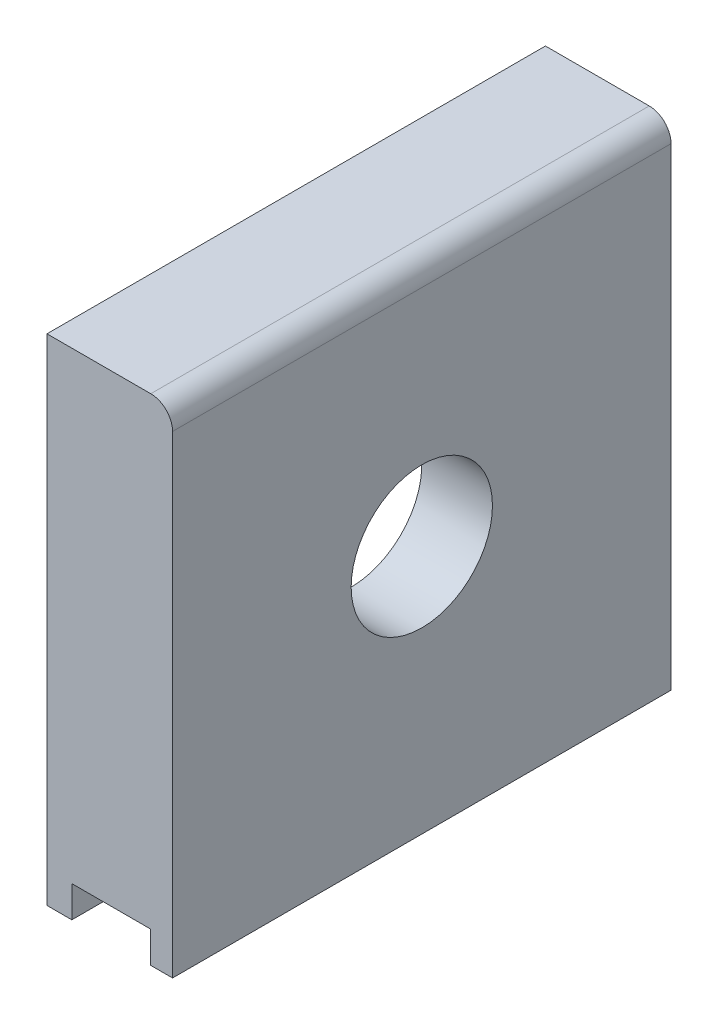
ISO-10303-21;
HEADER;
FILE_DESCRIPTION(('STEP AP214'),'2;1');
FILE_NAME('part.step','',(''),(''),'','','');
FILE_SCHEMA(('AUTOMOTIVE_DESIGN { 1 0 10303 214 1 1 1 1 }'));
ENDSEC;
DATA;
#1=APPLICATION_CONTEXT('core data for automotive mechanical design processes');
#2=APPLICATION_PROTOCOL_DEFINITION('international standard','automotive_design',2000,#1);
#3=PRODUCT_CONTEXT('',#1,'mechanical');
#4=PRODUCT('Part','Part','',(#3));
#5=PRODUCT_RELATED_PRODUCT_CATEGORY('part','',(#4));
#6=PRODUCT_DEFINITION_FORMATION('','',#4);
#7=PRODUCT_DEFINITION_CONTEXT('part definition',#1,'design');
#8=PRODUCT_DEFINITION('design','',#6,#7);
#9=PRODUCT_DEFINITION_SHAPE('','',#8);
#10=(LENGTH_UNIT() NAMED_UNIT(*) SI_UNIT(.MILLI.,.METRE.));
#11=(NAMED_UNIT(*) PLANE_ANGLE_UNIT() SI_UNIT($,.RADIAN.));
#12=(NAMED_UNIT(*) SI_UNIT($,.STERADIAN.) SOLID_ANGLE_UNIT());
#13=UNCERTAINTY_MEASURE_WITH_UNIT(LENGTH_MEASURE(1.E-05),#10,'distance_accuracy_value','');
#14=(GEOMETRIC_REPRESENTATION_CONTEXT(3) GLOBAL_UNCERTAINTY_ASSIGNED_CONTEXT((#13)) GLOBAL_UNIT_ASSIGNED_CONTEXT((#10,
#11,#12)) REPRESENTATION_CONTEXT('',''));
#15=CARTESIAN_POINT('',(0.,0.,0.));
#16=DIRECTION('',(0.,0.,1.));
#17=DIRECTION('',(1.,0.,0.));
#18=AXIS2_PLACEMENT_3D('',#15,#16,#17);
#19=CARTESIAN_POINT('',(0.,-58.3536796987528,-64.2855790451278));
#20=DIRECTION('',(0.,1.,0.));
#21=DIRECTION('',(-1.,0.,0.));
#22=AXIS2_PLACEMENT_3D('',#19,#20,#21);
#23=PLANE('',#22);
#24=DIRECTION('',(1.,0.,0.));
#25=VECTOR('',#24,1.);
#26=CARTESIAN_POINT('',(0.,-58.3536796987528,-31.75));
#27=LINE('',#26,#25);
#28=CARTESIAN_POINT('',(-30.425,-58.3536796987527,-31.75));
#29=VERTEX_POINT('',#28);
#30=CARTESIAN_POINT('',(-28.8411525679729,-58.3536796987527,-31.75));
#31=VERTEX_POINT('',#30);
#32=EDGE_CURVE('E167',#29,#31,#27,.T.);
#33=ORIENTED_EDGE('',*,*,#32,.T.);
#34=DIRECTION('',(0.,0.,-1.));
#35=VECTOR('',#34,1.);
#36=CARTESIAN_POINT('',(-28.8411525679729,-58.3536796987527,-31.75));
#37=LINE('',#36,#35);
#38=CARTESIAN_POINT('',(-28.8411525679729,-58.3536796987527,0.));
#39=VERTEX_POINT('',#38);
#40=EDGE_CURVE('E267',#39,#31,#37,.T.);
#41=ORIENTED_EDGE('',*,*,#40,.F.);
#42=DIRECTION('',(-1.,0.,0.));
#43=VECTOR('',#42,1.);
#44=CARTESIAN_POINT('',(0.,-58.3536796987528,0.));
#45=LINE('',#44,#43);
#46=CARTESIAN_POINT('',(-30.425,-58.3536796987527,0.));
#47=VERTEX_POINT('',#46);
#48=EDGE_CURVE('E190',#39,#47,#45,.T.);
#49=ORIENTED_EDGE('',*,*,#48,.T.);
#50=DIRECTION('',(0.,0.,1.));
#51=VECTOR('',#50,1.);
#52=CARTESIAN_POINT('',(-30.425,-58.3536796987527,-64.2855790451278));
#53=LINE('',#52,#51);
#54=EDGE_CURVE('E198',#29,#47,#53,.T.);
#55=ORIENTED_EDGE('',*,*,#54,.F.);
#56=EDGE_LOOP('',(#33,#41,#49,#55));
#57=FACE_BOUND('',#56,.T.);
#58=ADVANCED_FACE('F45',(#57),#23,.F.);
#59=CARTESIAN_POINT('',(-22.425,0.,-64.2855790451278));
#60=DIRECTION('',(1.,0.,0.));
#61=DIRECTION('',(0.,0.,-1.));
#62=AXIS2_PLACEMENT_3D('',#59,#60,#61);
#63=PLANE('',#62);
#64=CARTESIAN_POINT('',(-22.425,-42.4786796987528,-15.875));
#65=DIRECTION('',(1.,0.,0.));
#66=DIRECTION('',(0.,0.,-1.));
#67=AXIS2_PLACEMENT_3D('',#64,#65,#66);
#68=CIRCLE('',#67,4.50000000000001);
#69=CARTESIAN_POINT('',(-22.425,-42.4786796987528,-20.375));
#70=VERTEX_POINT('',#69);
#71=EDGE_CURVE('E148',#70,#70,#68,.F.);
#72=ORIENTED_EDGE('',*,*,#71,.T.);
#73=EDGE_LOOP('',(#72));
#74=FACE_BOUND('',#73,.T.);
#75=DIRECTION('',(0.,-1.,0.));
#76=VECTOR('',#75,1.);
#77=CARTESIAN_POINT('',(-22.425,0.,-31.75));
#78=LINE('',#77,#76);
#79=CARTESIAN_POINT('',(-22.425,-28.2044724546259,-31.75));
#80=VERTEX_POINT('',#79);
#81=CARTESIAN_POINT('',(-22.425,-58.3536796987527,-31.75));
#82=VERTEX_POINT('',#81);
#83=EDGE_CURVE('E171',#80,#82,#78,.T.);
#84=ORIENTED_EDGE('',*,*,#83,.F.);
#85=DIRECTION('',(0.,0.,1.));
#86=VECTOR('',#85,1.);
#87=CARTESIAN_POINT('',(-22.425,-28.2044724546259,-64.2855790451278));
#88=LINE('',#87,#86);
#89=CARTESIAN_POINT('',(-22.425,-28.2044724546259,0.));
#90=VERTEX_POINT('',#89);
#91=EDGE_CURVE('E195',#80,#90,#88,.T.);
#92=ORIENTED_EDGE('',*,*,#91,.T.);
#93=DIRECTION('',(0.,1.,0.));
#94=VECTOR('',#93,1.);
#95=CARTESIAN_POINT('',(-22.425,0.,0.));
#96=LINE('',#95,#94);
#97=CARTESIAN_POINT('',(-22.425,-58.3536796987527,0.));
#98=VERTEX_POINT('',#97);
#99=EDGE_CURVE('E160',#98,#90,#96,.T.);
#100=ORIENTED_EDGE('',*,*,#99,.F.);
#101=DIRECTION('',(0.,0.,1.));
#102=VECTOR('',#101,1.);
#103=CARTESIAN_POINT('',(-22.425,-58.3536796987527,-64.2855790451278));
#104=LINE('',#103,#102);
#105=EDGE_CURVE('E164',#82,#98,#104,.T.);
#106=ORIENTED_EDGE('',*,*,#105,.F.);
#107=EDGE_LOOP('',(#84,#92,#100,#106));
#108=FACE_BOUND('',#107,.T.);
#109=ADVANCED_FACE('F226',(#74,#108),#63,.T.);
#110=CARTESIAN_POINT('',(-23.8411525679729,-58.3536796987527,0.));
#111=VERTEX_POINT('',#110);
#112=EDGE_CURVE('E191',#98,#111,#45,.T.);
#113=ORIENTED_EDGE('',*,*,#112,.T.);
#114=DIRECTION('',(0.,0.,1.));
#115=VECTOR('',#114,1.);
#116=CARTESIAN_POINT('',(-23.8411525679729,-58.3536796987527,-31.75));
#117=LINE('',#116,#115);
#118=CARTESIAN_POINT('',(-23.8411525679729,-58.3536796987527,-31.75));
#119=VERTEX_POINT('',#118);
#120=EDGE_CURVE('E245',#119,#111,#117,.T.);
#121=ORIENTED_EDGE('',*,*,#120,.F.);
#122=EDGE_CURVE('E137',#119,#82,#27,.T.);
#123=ORIENTED_EDGE('',*,*,#122,.T.);
#124=ORIENTED_EDGE('',*,*,#105,.T.);
#125=EDGE_LOOP('',(#113,#121,#123,#124));
#126=FACE_BOUND('',#125,.T.);
#127=ADVANCED_FACE('F229',(#126),#23,.F.);
#128=CARTESIAN_POINT('',(-30.425,0.,-64.2855790451278));
#129=DIRECTION('',(-1.,0.,0.));
#130=DIRECTION('',(0.,0.,1.));
#131=AXIS2_PLACEMENT_3D('',#128,#129,#130);
#132=PLANE('',#131);
#133=CARTESIAN_POINT('',(-30.425,-42.4786796987528,-15.875));
#134=DIRECTION('',(-1.,0.,0.));
#135=DIRECTION('',(0.,0.,1.));
#136=AXIS2_PLACEMENT_3D('',#133,#134,#135);
#137=CIRCLE('',#136,11.5);
#138=CARTESIAN_POINT('',(-30.425,-42.4786796987528,-4.375));
#139=VERTEX_POINT('',#138);
#140=EDGE_CURVE('E11',#139,#139,#137,.F.);
#141=ORIENTED_EDGE('',*,*,#140,.T.);
#142=EDGE_LOOP('',(#141));
#143=FACE_BOUND('',#142,.T.);
#144=DIRECTION('',(0.,1.,0.));
#145=VECTOR('',#144,1.);
#146=CARTESIAN_POINT('',(-30.425,0.,-31.75));
#147=LINE('',#146,#145);
#148=CARTESIAN_POINT('',(-30.425,-26.8169724546259,-31.75));
#149=VERTEX_POINT('',#148);
#150=EDGE_CURVE('E69',#29,#149,#147,.T.);
#151=ORIENTED_EDGE('',*,*,#150,.F.);
#152=ORIENTED_EDGE('',*,*,#54,.T.);
#153=DIRECTION('',(0.,-1.,0.));
#154=VECTOR('',#153,1.);
#155=CARTESIAN_POINT('',(-30.425,0.,0.));
#156=LINE('',#155,#154);
#157=CARTESIAN_POINT('',(-30.425,-26.8169724546259,0.));
#158=VERTEX_POINT('',#157);
#159=EDGE_CURVE('E186',#158,#47,#156,.T.);
#160=ORIENTED_EDGE('',*,*,#159,.F.);
#161=DIRECTION('',(0.,0.,1.));
#162=VECTOR('',#161,1.);
#163=CARTESIAN_POINT('',(-30.425,-26.8169724546259,-64.2855790451278));
#164=LINE('',#163,#162);
#165=EDGE_CURVE('E202',#149,#158,#164,.T.);
#166=ORIENTED_EDGE('',*,*,#165,.F.);
#167=EDGE_LOOP('',(#151,#152,#160,#166));
#168=FACE_BOUND('',#167,.T.);
#169=ADVANCED_FACE('F237',(#143,#168),#132,.T.);
#170=CARTESIAN_POINT('',(0.,-26.8169724546259,-64.2855790451278));
#171=DIRECTION('',(0.,1.,0.));
#172=DIRECTION('',(0.,0.,1.));
#173=AXIS2_PLACEMENT_3D('',#170,#171,#172);
#174=PLANE('',#173);
#175=DIRECTION('',(1.,0.,0.));
#176=VECTOR('',#175,1.);
#177=CARTESIAN_POINT('',(0.,-26.8169724546259,-31.75));
#178=LINE('',#177,#176);
#179=CARTESIAN_POINT('',(-23.8125,-26.8169724546259,-31.75));
#180=VERTEX_POINT('',#179);
#181=EDGE_CURVE('E161',#149,#180,#178,.T.);
#182=ORIENTED_EDGE('',*,*,#181,.F.);
#183=ORIENTED_EDGE('',*,*,#165,.T.);
#184=DIRECTION('',(-1.,0.,0.));
#185=VECTOR('',#184,1.);
#186=CARTESIAN_POINT('',(0.,-26.8169724546259,0.));
#187=LINE('',#186,#185);
#188=CARTESIAN_POINT('',(-23.8125,-26.8169724546259,0.));
#189=VERTEX_POINT('',#188);
#190=EDGE_CURVE('E182',#189,#158,#187,.T.);
#191=ORIENTED_EDGE('',*,*,#190,.F.);
#192=DIRECTION('',(0.,0.,1.));
#193=VECTOR('',#192,1.);
#194=CARTESIAN_POINT('',(-23.8125,-26.8169724546259,-64.2855790451278));
#195=LINE('',#194,#193);
#196=EDGE_CURVE('E205',#180,#189,#195,.T.);
#197=ORIENTED_EDGE('',*,*,#196,.F.);
#198=EDGE_LOOP('',(#182,#183,#191,#197));
#199=FACE_BOUND('',#198,.T.);
#200=ADVANCED_FACE('F242',(#199),#174,.T.);
#201=CARTESIAN_POINT('',(-23.8125,-28.2044724546259,-64.2855790451278));
#202=DIRECTION('',(0.,0.,1.));
#203=DIRECTION('',(1.,0.,0.));
#204=AXIS2_PLACEMENT_3D('',#201,#202,#203);
#205=CYLINDRICAL_SURFACE('',#204,1.3875);
#206=CARTESIAN_POINT('',(-23.8125,-28.2044724546259,-31.75));
#207=DIRECTION('',(0.,0.,1.));
#208=DIRECTION('',(1.,0.,0.));
#209=AXIS2_PLACEMENT_3D('',#206,#207,#208);
#210=CIRCLE('',#209,1.3875);
#211=EDGE_CURVE('E174',#180,#80,#210,.F.);
#212=ORIENTED_EDGE('',*,*,#211,.F.);
#213=ORIENTED_EDGE('',*,*,#196,.T.);
#214=CARTESIAN_POINT('',(-23.8125,-28.2044724546259,0.));
#215=DIRECTION('',(0.,0.,1.));
#216=DIRECTION('',(1.,0.,0.));
#217=AXIS2_PLACEMENT_3D('',#214,#215,#216);
#218=CIRCLE('',#217,1.3875);
#219=EDGE_CURVE('E178',#90,#189,#218,.T.);
#220=ORIENTED_EDGE('',*,*,#219,.F.);
#221=ORIENTED_EDGE('',*,*,#91,.F.);
#222=EDGE_LOOP('',(#212,#213,#220,#221));
#223=FACE_BOUND('',#222,.T.);
#224=ADVANCED_FACE('F257',(#223),#205,.T.);
#225=CARTESIAN_POINT('',(0.,0.,0.));
#226=DIRECTION('',(0.,0.,1.));
#227=DIRECTION('',(1.,0.,0.));
#228=AXIS2_PLACEMENT_3D('',#225,#226,#227);
#229=PLANE('',#228);
#230=DIRECTION('',(0.,-1.,0.));
#231=VECTOR('',#230,1.);
#232=CARTESIAN_POINT('',(-28.8411525679729,-56.3536796987527,0.));
#233=LINE('',#232,#231);
#234=CARTESIAN_POINT('',(-28.8411525679729,-56.3536796987527,0.));
#235=VERTEX_POINT('',#234);
#236=EDGE_CURVE('E143',#235,#39,#233,.T.);
#237=ORIENTED_EDGE('',*,*,#236,.F.);
#238=DIRECTION('',(-1.,0.,0.));
#239=VECTOR('',#238,1.);
#240=CARTESIAN_POINT('',(-23.8411525679729,-56.3536796987527,0.));
#241=LINE('',#240,#239);
#242=CARTESIAN_POINT('',(-23.8411525679729,-56.3536796987527,0.));
#243=VERTEX_POINT('',#242);
#244=EDGE_CURVE('E126',#243,#235,#241,.T.);
#245=ORIENTED_EDGE('',*,*,#244,.F.);
#246=DIRECTION('',(0.,-1.,0.));
#247=VECTOR('',#246,1.);
#248=CARTESIAN_POINT('',(-23.8411525679729,-56.3536796987527,0.));
#249=LINE('',#248,#247);
#250=EDGE_CURVE('E123',#243,#111,#249,.T.);
#251=ORIENTED_EDGE('',*,*,#250,.T.);
#252=ORIENTED_EDGE('',*,*,#112,.F.);
#253=ORIENTED_EDGE('',*,*,#99,.T.);
#254=ORIENTED_EDGE('',*,*,#219,.T.);
#255=ORIENTED_EDGE('',*,*,#190,.T.);
#256=ORIENTED_EDGE('',*,*,#159,.T.);
#257=ORIENTED_EDGE('',*,*,#48,.F.);
#258=EDGE_LOOP('',(#237,#245,#251,#252,#253,#254,#255,#256,#257));
#259=FACE_BOUND('',#258,.T.);
#260=ADVANCED_FACE('F250',(#259),#229,.T.);
#261=CARTESIAN_POINT('',(0.,0.,-31.75));
#262=DIRECTION('',(0.,0.,1.));
#263=DIRECTION('',(0.,-1.,0.));
#264=AXIS2_PLACEMENT_3D('',#261,#262,#263);
#265=PLANE('',#264);
#266=DIRECTION('',(1.,0.,0.));
#267=VECTOR('',#266,1.);
#268=CARTESIAN_POINT('',(-23.8411525679729,-56.3536796987527,-31.75));
#269=LINE('',#268,#267);
#270=CARTESIAN_POINT('',(-28.8411525679729,-56.3536796987527,-31.75));
#271=VERTEX_POINT('',#270);
#272=CARTESIAN_POINT('',(-23.8411525679729,-56.3536796987527,-31.75));
#273=VERTEX_POINT('',#272);
#274=EDGE_CURVE('E127',#271,#273,#269,.T.);
#275=ORIENTED_EDGE('',*,*,#274,.F.);
#276=DIRECTION('',(0.,-1.,0.));
#277=VECTOR('',#276,1.);
#278=CARTESIAN_POINT('',(-28.8411525679729,-56.3536796987527,-31.75));
#279=LINE('',#278,#277);
#280=EDGE_CURVE('E139',#271,#31,#279,.T.);
#281=ORIENTED_EDGE('',*,*,#280,.T.);
#282=ORIENTED_EDGE('',*,*,#32,.F.);
#283=ORIENTED_EDGE('',*,*,#150,.T.);
#284=ORIENTED_EDGE('',*,*,#181,.T.);
#285=ORIENTED_EDGE('',*,*,#211,.T.);
#286=ORIENTED_EDGE('',*,*,#83,.T.);
#287=ORIENTED_EDGE('',*,*,#122,.F.);
#288=DIRECTION('',(0.,-1.,0.));
#289=VECTOR('',#288,1.);
#290=CARTESIAN_POINT('',(-23.8411525679729,-56.3536796987527,-31.75));
#291=LINE('',#290,#289);
#292=EDGE_CURVE('E120',#273,#119,#291,.T.);
#293=ORIENTED_EDGE('',*,*,#292,.F.);
#294=EDGE_LOOP('',(#275,#281,#282,#283,#284,#285,#286,#287,#293));
#295=FACE_BOUND('',#294,.T.);
#296=ADVANCED_FACE('F135',(#295),#265,.F.);
#297=CARTESIAN_POINT('',(-26.925,-42.4786796987528,-15.875));
#298=DIRECTION('',(-1.,0.,0.));
#299=DIRECTION('',(0.,0.,1.));
#300=AXIS2_PLACEMENT_3D('',#297,#298,#299);
#301=CYLINDRICAL_SURFACE('',#300,11.25);
#302=CARTESIAN_POINT('',(-30.175,-42.4786796987528,-15.875));
#303=DIRECTION('',(-1.,0.,0.));
#304=DIRECTION('',(0.,0.,1.));
#305=AXIS2_PLACEMENT_3D('',#302,#303,#304);
#306=CIRCLE('',#305,11.25);
#307=CARTESIAN_POINT('',(-30.175,-42.4786796987528,-4.625));
#308=VERTEX_POINT('',#307);
#309=EDGE_CURVE('E54',#308,#308,#306,.T.);
#310=ORIENTED_EDGE('',*,*,#309,.T.);
#311=EDGE_LOOP('',(#310));
#312=FACE_BOUND('',#311,.T.);
#313=CARTESIAN_POINT('',(-26.925,-42.4786796987528,-15.875));
#314=DIRECTION('',(-1.,0.,0.));
#315=DIRECTION('',(0.,0.,1.));
#316=AXIS2_PLACEMENT_3D('',#313,#314,#315);
#317=CIRCLE('',#316,11.25);
#318=CARTESIAN_POINT('',(-26.925,-42.4786796987528,-4.625));
#319=VERTEX_POINT('',#318);
#320=EDGE_CURVE('E156',#319,#319,#317,.T.);
#321=ORIENTED_EDGE('',*,*,#320,.F.);
#322=EDGE_LOOP('',(#321));
#323=FACE_BOUND('',#322,.T.);
#324=ADVANCED_FACE('F215',(#312,#323),#301,.F.);
#325=CARTESIAN_POINT('',(-26.925,-42.4786796987528,-15.875));
#326=DIRECTION('',(-1.,0.,0.));
#327=DIRECTION('',(0.,0.,1.));
#328=AXIS2_PLACEMENT_3D('',#325,#326,#327);
#329=PLANE('',#328);
#330=CARTESIAN_POINT('',(-26.925,-42.4786796987528,-15.875));
#331=DIRECTION('',(-1.,0.,0.));
#332=DIRECTION('',(0.,0.,1.));
#333=AXIS2_PLACEMENT_3D('',#330,#331,#332);
#334=CIRCLE('',#333,4.50000000000001);
#335=CARTESIAN_POINT('',(-26.925,-42.4786796987528,-11.375));
#336=VERTEX_POINT('',#335);
#337=EDGE_CURVE('E152',#336,#336,#334,.T.);
#338=ORIENTED_EDGE('',*,*,#337,.F.);
#339=EDGE_LOOP('',(#338));
#340=FACE_BOUND('',#339,.T.);
#341=ORIENTED_EDGE('',*,*,#320,.T.);
#342=EDGE_LOOP('',(#341));
#343=FACE_BOUND('',#342,.T.);
#344=ADVANCED_FACE('F288',(#340,#343),#329,.T.);
#345=CARTESIAN_POINT('',(-22.424,-42.4786796987528,-15.875));
#346=DIRECTION('',(-1.,0.,0.));
#347=DIRECTION('',(0.,0.,1.));
#348=AXIS2_PLACEMENT_3D('',#345,#346,#347);
#349=CYLINDRICAL_SURFACE('',#348,4.50000000000001);
#350=ORIENTED_EDGE('',*,*,#337,.T.);
#351=EDGE_LOOP('',(#350));
#352=FACE_BOUND('',#351,.T.);
#353=ORIENTED_EDGE('',*,*,#71,.F.);
#354=EDGE_LOOP('',(#353));
#355=FACE_BOUND('',#354,.T.);
#356=ADVANCED_FACE('F281',(#352,#355),#349,.F.);
#357=CARTESIAN_POINT('',(-28.8411525679729,-56.3536796987527,-31.75));
#358=DIRECTION('',(-1.,0.,0.));
#359=DIRECTION('',(0.,-1.,0.));
#360=AXIS2_PLACEMENT_3D('',#357,#358,#359);
#361=PLANE('',#360);
#362=ORIENTED_EDGE('',*,*,#40,.T.);
#363=ORIENTED_EDGE('',*,*,#280,.F.);
#364=DIRECTION('',(0.,0.,-1.));
#365=VECTOR('',#364,1.);
#366=CARTESIAN_POINT('',(-28.8411525679729,-56.3536796987527,-31.75));
#367=LINE('',#366,#365);
#368=EDGE_CURVE('E61',#235,#271,#367,.T.);
#369=ORIENTED_EDGE('',*,*,#368,.F.);
#370=ORIENTED_EDGE('',*,*,#236,.T.);
#371=EDGE_LOOP('',(#362,#363,#369,#370));
#372=FACE_BOUND('',#371,.T.);
#373=ADVANCED_FACE('F279',(#372),#361,.F.);
#374=CARTESIAN_POINT('',(-23.8411525679729,-56.3536796987527,-31.75));
#375=DIRECTION('',(1.,0.,0.));
#376=DIRECTION('',(0.,1.,0.));
#377=AXIS2_PLACEMENT_3D('',#374,#375,#376);
#378=PLANE('',#377);
#379=ORIENTED_EDGE('',*,*,#120,.T.);
#380=ORIENTED_EDGE('',*,*,#250,.F.);
#381=DIRECTION('',(0.,0.,1.));
#382=VECTOR('',#381,1.);
#383=CARTESIAN_POINT('',(-23.8411525679729,-56.3536796987527,-31.75));
#384=LINE('',#383,#382);
#385=EDGE_CURVE('E117',#273,#243,#384,.T.);
#386=ORIENTED_EDGE('',*,*,#385,.F.);
#387=ORIENTED_EDGE('',*,*,#292,.T.);
#388=EDGE_LOOP('',(#379,#380,#386,#387));
#389=FACE_BOUND('',#388,.T.);
#390=ADVANCED_FACE('F118',(#389),#378,.F.);
#391=CARTESIAN_POINT('',(0.,-56.3536796987528,0.));
#392=DIRECTION('',(0.,-1.,0.));
#393=DIRECTION('',(1.,0.,0.));
#394=AXIS2_PLACEMENT_3D('',#391,#392,#393);
#395=PLANE('',#394);
#396=ORIENTED_EDGE('',*,*,#368,.T.);
#397=ORIENTED_EDGE('',*,*,#274,.T.);
#398=ORIENTED_EDGE('',*,*,#385,.T.);
#399=ORIENTED_EDGE('',*,*,#244,.T.);
#400=EDGE_LOOP('',(#396,#397,#398,#399));
#401=FACE_BOUND('',#400,.T.);
#402=ADVANCED_FACE('F130',(#401),#395,.T.);
#403=CARTESIAN_POINT('',(-30.175,-42.4786796987528,-15.875));
#404=DIRECTION('',(-1.,0.,0.));
#405=DIRECTION('',(0.,0.,1.));
#406=AXIS2_PLACEMENT_3D('',#403,#404,#405);
#407=CONICAL_SURFACE('',#406,11.25,0.785398163397459);
#408=ORIENTED_EDGE('',*,*,#140,.F.);
#409=EDGE_LOOP('',(#408));
#410=FACE_BOUND('',#409,.T.);
#411=ORIENTED_EDGE('',*,*,#309,.F.);
#412=EDGE_LOOP('',(#411));
#413=FACE_BOUND('',#412,.T.);
#414=ADVANCED_FACE('F47',(#410,#413),#407,.F.);
#415=CLOSED_SHELL('',(#58,#109,#127,#169,#200,#224,#260,#296,#324,#344,#356,#373,#390,#402,#414));
#416=MANIFOLD_SOLID_BREP('B2',#415);
#417=ADVANCED_BREP_SHAPE_REPRESENTATION('',(#18,#416),#14);
#418=SHAPE_DEFINITION_REPRESENTATION(#9,#417);
ENDSEC;
END-ISO-10303-21;
